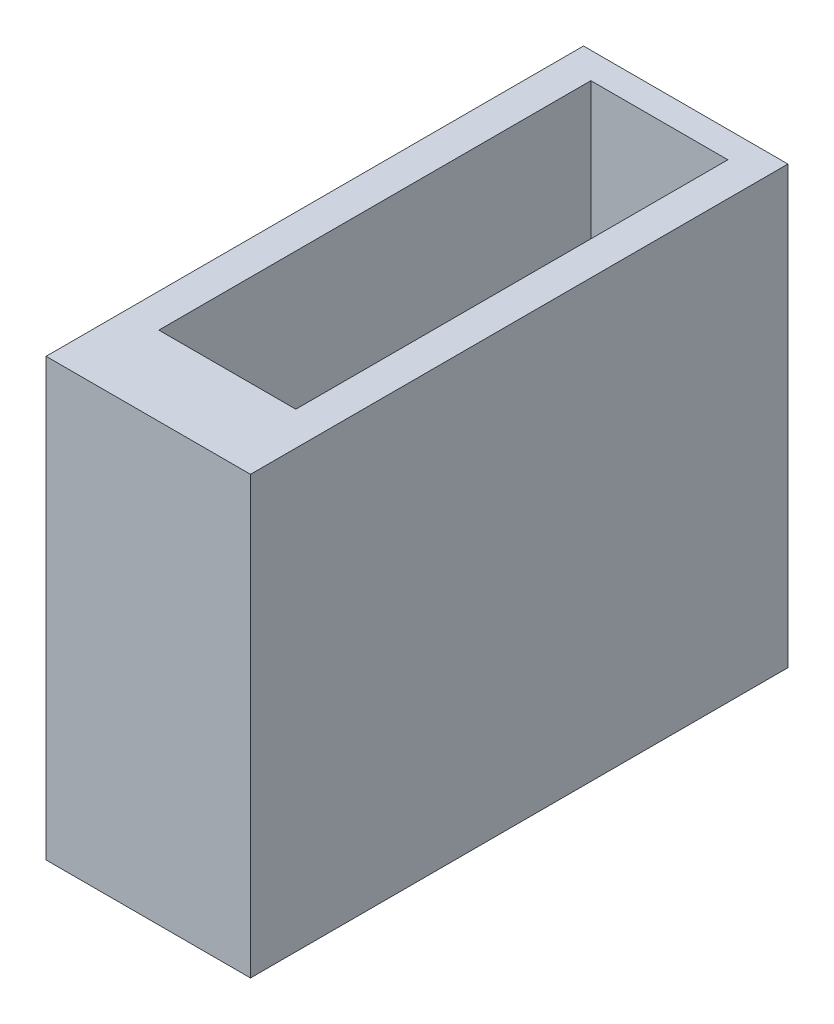
ISO-10303-21;
HEADER;
FILE_DESCRIPTION(('STEP AP214'),'2;1');
FILE_NAME('part.step','',(''),(''),'','','');
FILE_SCHEMA(('AUTOMOTIVE_DESIGN { 1 0 10303 214 1 1 1 1 }'));
ENDSEC;
DATA;
#1=APPLICATION_CONTEXT('core data for automotive mechanical design processes');
#2=APPLICATION_PROTOCOL_DEFINITION('international standard','automotive_design',2000,#1);
#3=PRODUCT_CONTEXT('',#1,'mechanical');
#4=PRODUCT('Part','Part','',(#3));
#5=PRODUCT_RELATED_PRODUCT_CATEGORY('part','',(#4));
#6=PRODUCT_DEFINITION_FORMATION('','',#4);
#7=PRODUCT_DEFINITION_CONTEXT('part definition',#1,'design');
#8=PRODUCT_DEFINITION('design','',#6,#7);
#9=PRODUCT_DEFINITION_SHAPE('','',#8);
#10=(LENGTH_UNIT() NAMED_UNIT(*) SI_UNIT(.MILLI.,.METRE.));
#11=(NAMED_UNIT(*) PLANE_ANGLE_UNIT() SI_UNIT($,.RADIAN.));
#12=(NAMED_UNIT(*) SI_UNIT($,.STERADIAN.) SOLID_ANGLE_UNIT());
#13=UNCERTAINTY_MEASURE_WITH_UNIT(LENGTH_MEASURE(1.E-05),#10,'distance_accuracy_value','');
#14=(GEOMETRIC_REPRESENTATION_CONTEXT(3) GLOBAL_UNCERTAINTY_ASSIGNED_CONTEXT((#13)) GLOBAL_UNIT_ASSIGNED_CONTEXT((#10,
#11,#12)) REPRESENTATION_CONTEXT('',''));
#15=CARTESIAN_POINT('',(0.,0.,0.));
#16=DIRECTION('',(0.,0.,1.));
#17=DIRECTION('',(1.,0.,0.));
#18=AXIS2_PLACEMENT_3D('',#15,#16,#17);
#19=CARTESIAN_POINT('',(-26.9126616915232,-55.5057894736843,102.));
#20=DIRECTION('',(1.,0.,0.));
#21=DIRECTION('',(0.,0.,-1.));
#22=AXIS2_PLACEMENT_3D('',#19,#20,#21);
#23=PLANE('',#22);
#24=DIRECTION('',(0.,-1.,0.));
#25=VECTOR('',#24,1.);
#26=CARTESIAN_POINT('',(-26.9126616915232,-55.5057894736843,0.));
#27=LINE('',#26,#25);
#28=CARTESIAN_POINT('',(-26.9126616915232,27.2842105263157,0.));
#29=VERTEX_POINT('',#28);
#30=CARTESIAN_POINT('',(-26.9126616915232,-55.5057894736843,0.));
#31=VERTEX_POINT('',#30);
#32=EDGE_CURVE('E132',#29,#31,#27,.T.);
#33=ORIENTED_EDGE('',*,*,#32,.T.);
#34=DIRECTION('',(0.,0.,-1.));
#35=VECTOR('',#34,1.);
#36=CARTESIAN_POINT('',(-26.9126616915232,-55.5057894736843,102.));
#37=LINE('',#36,#35);
#38=CARTESIAN_POINT('',(-26.9126616915232,-55.5057894736843,102.));
#39=VERTEX_POINT('',#38);
#40=EDGE_CURVE('E11',#39,#31,#37,.T.);
#41=ORIENTED_EDGE('',*,*,#40,.F.);
#42=DIRECTION('',(0.,-1.,0.));
#43=VECTOR('',#42,1.);
#44=CARTESIAN_POINT('',(-26.9126616915232,-55.5057894736843,102.));
#45=LINE('',#44,#43);
#46=CARTESIAN_POINT('',(-26.9126616915232,27.2842105263157,102.));
#47=VERTEX_POINT('',#46);
#48=EDGE_CURVE('E136',#47,#39,#45,.T.);
#49=ORIENTED_EDGE('',*,*,#48,.F.);
#50=DIRECTION('',(0.,0.,-1.));
#51=VECTOR('',#50,1.);
#52=CARTESIAN_POINT('',(-26.9126616915232,27.2842105263157,102.));
#53=LINE('',#52,#51);
#54=EDGE_CURVE('E146',#47,#29,#53,.T.);
#55=ORIENTED_EDGE('',*,*,#54,.T.);
#56=EDGE_LOOP('',(#33,#41,#49,#55));
#57=FACE_BOUND('',#56,.T.);
#58=ADVANCED_FACE('F35',(#57),#23,.F.);
#59=CARTESIAN_POINT('',(-26.9126616915232,-55.5057894736843,102.));
#60=DIRECTION('',(0.,1.,0.));
#61=DIRECTION('',(0.,0.,1.));
#62=AXIS2_PLACEMENT_3D('',#59,#60,#61);
#63=PLANE('',#62);
#64=DIRECTION('',(1.,0.,0.));
#65=VECTOR('',#64,1.);
#66=CARTESIAN_POINT('',(-20.5126616915232,-55.5057894736843,5.));
#67=LINE('',#66,#65);
#68=CARTESIAN_POINT('',(-20.5126616915232,-55.5057894736843,5.00000000000001));
#69=VERTEX_POINT('',#68);
#70=CARTESIAN_POINT('',(5.48733830847679,-55.5057894736843,5.));
#71=VERTEX_POINT('',#70);
#72=EDGE_CURVE('E126',#69,#71,#67,.T.);
#73=ORIENTED_EDGE('',*,*,#72,.F.);
#74=DIRECTION('',(0.,0.,-1.));
#75=VECTOR('',#74,1.);
#76=CARTESIAN_POINT('',(-20.5126616915232,-55.5057894736843,87.));
#77=LINE('',#76,#75);
#78=CARTESIAN_POINT('',(-20.5126616915232,-55.5057894736843,87.));
#79=VERTEX_POINT('',#78);
#80=EDGE_CURVE('E49',#79,#69,#77,.T.);
#81=ORIENTED_EDGE('',*,*,#80,.F.);
#82=DIRECTION('',(-1.,0.,0.));
#83=VECTOR('',#82,1.);
#84=CARTESIAN_POINT('',(-20.5126616915232,-55.5057894736843,87.));
#85=LINE('',#84,#83);
#86=CARTESIAN_POINT('',(5.48733830847678,-55.5057894736843,87.));
#87=VERTEX_POINT('',#86);
#88=EDGE_CURVE('E117',#87,#79,#85,.T.);
#89=ORIENTED_EDGE('',*,*,#88,.F.);
#90=DIRECTION('',(0.,0.,1.));
#91=VECTOR('',#90,1.);
#92=CARTESIAN_POINT('',(5.48733830847678,-55.5057894736843,87.));
#93=LINE('',#92,#91);
#94=EDGE_CURVE('E120',#71,#87,#93,.T.);
#95=ORIENTED_EDGE('',*,*,#94,.F.);
#96=EDGE_LOOP('',(#73,#81,#89,#95));
#97=FACE_BOUND('',#96,.T.);
#98=DIRECTION('',(1.,0.,0.));
#99=VECTOR('',#98,1.);
#100=CARTESIAN_POINT('',(-26.9126616915232,-55.5057894736843,0.));
#101=LINE('',#100,#99);
#102=CARTESIAN_POINT('',(11.8873383084768,-55.5057894736843,0.));
#103=VERTEX_POINT('',#102);
#104=EDGE_CURVE('E149',#31,#103,#101,.T.);
#105=ORIENTED_EDGE('',*,*,#104,.T.);
#106=DIRECTION('',(0.,0.,-1.));
#107=VECTOR('',#106,1.);
#108=CARTESIAN_POINT('',(11.8873383084768,-55.5057894736843,102.));
#109=LINE('',#108,#107);
#110=CARTESIAN_POINT('',(11.8873383084768,-55.5057894736843,102.));
#111=VERTEX_POINT('',#110);
#112=EDGE_CURVE('E42',#111,#103,#109,.T.);
#113=ORIENTED_EDGE('',*,*,#112,.F.);
#114=DIRECTION('',(1.,0.,0.));
#115=VECTOR('',#114,1.);
#116=CARTESIAN_POINT('',(-26.9126616915232,-55.5057894736843,102.));
#117=LINE('',#116,#115);
#118=EDGE_CURVE('E139',#39,#111,#117,.T.);
#119=ORIENTED_EDGE('',*,*,#118,.F.);
#120=ORIENTED_EDGE('',*,*,#40,.T.);
#121=EDGE_LOOP('',(#105,#113,#119,#120));
#122=FACE_BOUND('',#121,.T.);
#123=ADVANCED_FACE('F177',(#97,#122),#63,.F.);
#124=CARTESIAN_POINT('',(11.8873383084768,-55.5057894736843,102.));
#125=DIRECTION('',(-1.,0.,0.));
#126=DIRECTION('',(0.,0.,1.));
#127=AXIS2_PLACEMENT_3D('',#124,#125,#126);
#128=PLANE('',#127);
#129=DIRECTION('',(0.,1.,0.));
#130=VECTOR('',#129,1.);
#131=CARTESIAN_POINT('',(11.8873383084768,-55.5057894736843,0.));
#132=LINE('',#131,#130);
#133=CARTESIAN_POINT('',(11.8873383084768,27.2842105263157,0.));
#134=VERTEX_POINT('',#133);
#135=EDGE_CURVE('E151',#103,#134,#132,.T.);
#136=ORIENTED_EDGE('',*,*,#135,.T.);
#137=DIRECTION('',(0.,0.,-1.));
#138=VECTOR('',#137,1.);
#139=CARTESIAN_POINT('',(11.8873383084768,27.2842105263157,102.));
#140=LINE('',#139,#138);
#141=CARTESIAN_POINT('',(11.8873383084768,27.2842105263157,102.));
#142=VERTEX_POINT('',#141);
#143=EDGE_CURVE('E156',#142,#134,#140,.T.);
#144=ORIENTED_EDGE('',*,*,#143,.F.);
#145=DIRECTION('',(0.,1.,0.));
#146=VECTOR('',#145,1.);
#147=CARTESIAN_POINT('',(11.8873383084768,-55.5057894736843,102.));
#148=LINE('',#147,#146);
#149=EDGE_CURVE('E142',#111,#142,#148,.T.);
#150=ORIENTED_EDGE('',*,*,#149,.F.);
#151=ORIENTED_EDGE('',*,*,#112,.T.);
#152=EDGE_LOOP('',(#136,#144,#150,#151));
#153=FACE_BOUND('',#152,.T.);
#154=ADVANCED_FACE('F163',(#153),#128,.F.);
#155=CARTESIAN_POINT('',(-26.9126616915232,27.2842105263157,102.));
#156=DIRECTION('',(0.,-1.,0.));
#157=DIRECTION('',(1.,0.,0.));
#158=AXIS2_PLACEMENT_3D('',#155,#156,#157);
#159=PLANE('',#158);
#160=DIRECTION('',(-1.,0.,0.));
#161=VECTOR('',#160,1.);
#162=CARTESIAN_POINT('',(-20.5126616915232,27.2842105263157,87.));
#163=LINE('',#162,#161);
#164=CARTESIAN_POINT('',(5.48733830847678,27.2842105263157,87.));
#165=VERTEX_POINT('',#164);
#166=CARTESIAN_POINT('',(-20.5126616915232,27.2842105263157,87.));
#167=VERTEX_POINT('',#166);
#168=EDGE_CURVE('E107',#165,#167,#163,.T.);
#169=ORIENTED_EDGE('',*,*,#168,.T.);
#170=DIRECTION('',(0.,0.,-1.));
#171=VECTOR('',#170,1.);
#172=CARTESIAN_POINT('',(-20.5126616915232,27.2842105263157,87.));
#173=LINE('',#172,#171);
#174=CARTESIAN_POINT('',(-20.5126616915232,27.2842105263157,5.));
#175=VERTEX_POINT('',#174);
#176=EDGE_CURVE('E101',#167,#175,#173,.T.);
#177=ORIENTED_EDGE('',*,*,#176,.T.);
#178=DIRECTION('',(1.,0.,0.));
#179=VECTOR('',#178,1.);
#180=CARTESIAN_POINT('',(-20.5126616915232,27.2842105263157,5.));
#181=LINE('',#180,#179);
#182=CARTESIAN_POINT('',(5.48733830847679,27.2842105263157,5.00000000000001));
#183=VERTEX_POINT('',#182);
#184=EDGE_CURVE('E110',#175,#183,#181,.T.);
#185=ORIENTED_EDGE('',*,*,#184,.T.);
#186=DIRECTION('',(0.,0.,1.));
#187=VECTOR('',#186,1.);
#188=CARTESIAN_POINT('',(5.48733830847678,27.2842105263157,87.));
#189=LINE('',#188,#187);
#190=EDGE_CURVE('E57',#183,#165,#189,.T.);
#191=ORIENTED_EDGE('',*,*,#190,.T.);
#192=EDGE_LOOP('',(#169,#177,#185,#191));
#193=FACE_BOUND('',#192,.T.);
#194=DIRECTION('',(-1.,0.,0.));
#195=VECTOR('',#194,1.);
#196=CARTESIAN_POINT('',(-26.9126616915232,27.2842105263157,0.));
#197=LINE('',#196,#195);
#198=EDGE_CURVE('E140',#134,#29,#197,.T.);
#199=ORIENTED_EDGE('',*,*,#198,.T.);
#200=ORIENTED_EDGE('',*,*,#54,.F.);
#201=DIRECTION('',(-1.,0.,0.));
#202=VECTOR('',#201,1.);
#203=CARTESIAN_POINT('',(-26.9126616915232,27.2842105263157,102.));
#204=LINE('',#203,#202);
#205=EDGE_CURVE('E144',#142,#47,#204,.T.);
#206=ORIENTED_EDGE('',*,*,#205,.F.);
#207=ORIENTED_EDGE('',*,*,#143,.T.);
#208=EDGE_LOOP('',(#199,#200,#206,#207));
#209=FACE_BOUND('',#208,.T.);
#210=ADVANCED_FACE('F114',(#193,#209),#159,.F.);
#211=CARTESIAN_POINT('',(0.,0.,102.));
#212=DIRECTION('',(0.,0.,-1.));
#213=DIRECTION('',(-1.,0.,0.));
#214=AXIS2_PLACEMENT_3D('',#211,#212,#213);
#215=PLANE('',#214);
#216=ORIENTED_EDGE('',*,*,#48,.T.);
#217=ORIENTED_EDGE('',*,*,#118,.T.);
#218=ORIENTED_EDGE('',*,*,#149,.T.);
#219=ORIENTED_EDGE('',*,*,#205,.T.);
#220=EDGE_LOOP('',(#216,#217,#218,#219));
#221=FACE_BOUND('',#220,.T.);
#222=ADVANCED_FACE('F176',(#221),#215,.F.);
#223=CARTESIAN_POINT('',(0.,0.,0.));
#224=DIRECTION('',(0.,0.,-1.));
#225=DIRECTION('',(-1.,0.,0.));
#226=AXIS2_PLACEMENT_3D('',#223,#224,#225);
#227=PLANE('',#226);
#228=ORIENTED_EDGE('',*,*,#32,.F.);
#229=ORIENTED_EDGE('',*,*,#198,.F.);
#230=ORIENTED_EDGE('',*,*,#135,.F.);
#231=ORIENTED_EDGE('',*,*,#104,.F.);
#232=EDGE_LOOP('',(#228,#229,#230,#231));
#233=FACE_BOUND('',#232,.T.);
#234=ADVANCED_FACE('F169',(#233),#227,.T.);
#235=CARTESIAN_POINT('',(-20.5126616915232,27.2842105263157,87.));
#236=DIRECTION('',(-1.,0.,0.));
#237=DIRECTION('',(0.,0.,1.));
#238=AXIS2_PLACEMENT_3D('',#235,#236,#237);
#239=PLANE('',#238);
#240=ORIENTED_EDGE('',*,*,#80,.T.);
#241=DIRECTION('',(0.,-1.,0.));
#242=VECTOR('',#241,1.);
#243=CARTESIAN_POINT('',(-20.5126616915232,27.2842105263157,5.));
#244=LINE('',#243,#242);
#245=EDGE_CURVE('E97',#175,#69,#244,.T.);
#246=ORIENTED_EDGE('',*,*,#245,.F.);
#247=ORIENTED_EDGE('',*,*,#176,.F.);
#248=DIRECTION('',(0.,-1.,0.));
#249=VECTOR('',#248,1.);
#250=CARTESIAN_POINT('',(-20.5126616915232,27.2842105263157,87.));
#251=LINE('',#250,#249);
#252=EDGE_CURVE('E130',#167,#79,#251,.T.);
#253=ORIENTED_EDGE('',*,*,#252,.T.);
#254=EDGE_LOOP('',(#240,#246,#247,#253));
#255=FACE_BOUND('',#254,.T.);
#256=ADVANCED_FACE('F99',(#255),#239,.F.);
#257=CARTESIAN_POINT('',(-20.5126616915232,27.2842105263157,87.));
#258=DIRECTION('',(0.,0.,1.));
#259=DIRECTION('',(1.,0.,0.));
#260=AXIS2_PLACEMENT_3D('',#257,#258,#259);
#261=PLANE('',#260);
#262=ORIENTED_EDGE('',*,*,#88,.T.);
#263=ORIENTED_EDGE('',*,*,#252,.F.);
#264=ORIENTED_EDGE('',*,*,#168,.F.);
#265=DIRECTION('',(0.,-1.,0.));
#266=VECTOR('',#265,1.);
#267=CARTESIAN_POINT('',(5.48733830847678,27.2842105263157,87.));
#268=LINE('',#267,#266);
#269=EDGE_CURVE('E133',#165,#87,#268,.T.);
#270=ORIENTED_EDGE('',*,*,#269,.T.);
#271=EDGE_LOOP('',(#262,#263,#264,#270));
#272=FACE_BOUND('',#271,.T.);
#273=ADVANCED_FACE('F194',(#272),#261,.F.);
#274=CARTESIAN_POINT('',(5.48733830847678,27.2842105263157,87.));
#275=DIRECTION('',(1.,0.,0.));
#276=DIRECTION('',(0.,0.,-1.));
#277=AXIS2_PLACEMENT_3D('',#274,#275,#276);
#278=PLANE('',#277);
#279=ORIENTED_EDGE('',*,*,#94,.T.);
#280=ORIENTED_EDGE('',*,*,#269,.F.);
#281=ORIENTED_EDGE('',*,*,#190,.F.);
#282=DIRECTION('',(0.,-1.,0.));
#283=VECTOR('',#282,1.);
#284=CARTESIAN_POINT('',(5.48733830847679,27.2842105263157,5.));
#285=LINE('',#284,#283);
#286=EDGE_CURVE('E106',#183,#71,#285,.T.);
#287=ORIENTED_EDGE('',*,*,#286,.T.);
#288=EDGE_LOOP('',(#279,#280,#281,#287));
#289=FACE_BOUND('',#288,.T.);
#290=ADVANCED_FACE('F197',(#289),#278,.F.);
#291=CARTESIAN_POINT('',(-20.5126616915232,27.2842105263157,5.));
#292=DIRECTION('',(0.,0.,-1.));
#293=DIRECTION('',(-1.,0.,0.));
#294=AXIS2_PLACEMENT_3D('',#291,#292,#293);
#295=PLANE('',#294);
#296=ORIENTED_EDGE('',*,*,#72,.T.);
#297=ORIENTED_EDGE('',*,*,#286,.F.);
#298=ORIENTED_EDGE('',*,*,#184,.F.);
#299=ORIENTED_EDGE('',*,*,#245,.T.);
#300=EDGE_LOOP('',(#296,#297,#298,#299));
#301=FACE_BOUND('',#300,.T.);
#302=ADVANCED_FACE('F111',(#301),#295,.F.);
#303=CLOSED_SHELL('',(#58,#123,#154,#210,#222,#234,#256,#273,#290,#302));
#304=MANIFOLD_SOLID_BREP('B2',#303);
#305=ADVANCED_BREP_SHAPE_REPRESENTATION('',(#18,#304),#14);
#306=SHAPE_DEFINITION_REPRESENTATION(#9,#305);
ENDSEC;
END-ISO-10303-21;
